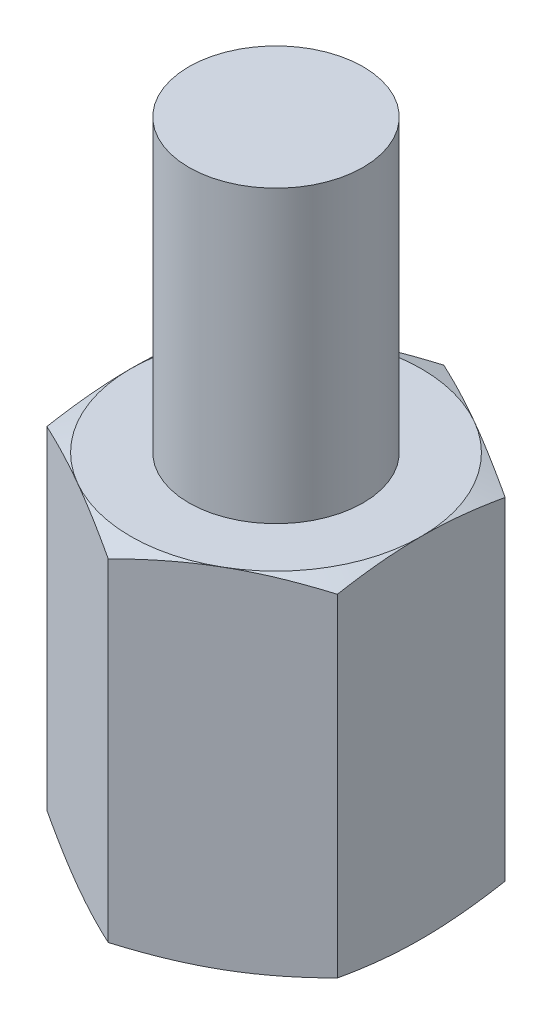
ISO-10303-21;
HEADER;
FILE_DESCRIPTION(('STEP AP214'),'2;1');
FILE_NAME('part.step','',(''),(''),'','','');
FILE_SCHEMA(('AUTOMOTIVE_DESIGN { 1 0 10303 214 1 1 1 1 }'));
ENDSEC;
DATA;
#1=APPLICATION_CONTEXT('core data for automotive mechanical design processes');
#2=APPLICATION_PROTOCOL_DEFINITION('international standard','automotive_design',2000,#1);
#3=PRODUCT_CONTEXT('',#1,'mechanical');
#4=PRODUCT('Part','Part','',(#3));
#5=PRODUCT_RELATED_PRODUCT_CATEGORY('part','',(#4));
#6=PRODUCT_DEFINITION_FORMATION('','',#4);
#7=PRODUCT_DEFINITION_CONTEXT('part definition',#1,'design');
#8=PRODUCT_DEFINITION('design','',#6,#7);
#9=PRODUCT_DEFINITION_SHAPE('','',#8);
#10=(LENGTH_UNIT() NAMED_UNIT(*) SI_UNIT(.MILLI.,.METRE.));
#11=(NAMED_UNIT(*) PLANE_ANGLE_UNIT() SI_UNIT($,.RADIAN.));
#12=(NAMED_UNIT(*) SI_UNIT($,.STERADIAN.) SOLID_ANGLE_UNIT());
#13=UNCERTAINTY_MEASURE_WITH_UNIT(LENGTH_MEASURE(1.E-05),#10,'distance_accuracy_value','');
#14=(GEOMETRIC_REPRESENTATION_CONTEXT(3) GLOBAL_UNCERTAINTY_ASSIGNED_CONTEXT((#13)) GLOBAL_UNIT_ASSIGNED_CONTEXT((#10,
#11,#12)) REPRESENTATION_CONTEXT('',''));
#15=CARTESIAN_POINT('',(0.,0.,0.));
#16=DIRECTION('',(0.,0.,1.));
#17=DIRECTION('',(1.,0.,0.));
#18=AXIS2_PLACEMENT_3D('',#15,#16,#17);
#19=CARTESIAN_POINT('',(0.,6.,0.));
#20=DIRECTION('',(0.,-1.,0.));
#21=DIRECTION('',(0.,0.,-1.));
#22=AXIS2_PLACEMENT_3D('',#19,#20,#21);
#23=CYLINDRICAL_SURFACE('',#22,1.5);
#24=CARTESIAN_POINT('',(0.,0.,0.));
#25=DIRECTION('',(0.,1.,0.));
#26=DIRECTION('',(0.,0.,1.));
#27=AXIS2_PLACEMENT_3D('',#24,#25,#26);
#28=CIRCLE('',#27,1.5);
#29=CARTESIAN_POINT('',(0.,0.,1.5));
#30=VERTEX_POINT('',#29);
#31=EDGE_CURVE('E260',#30,#30,#28,.T.);
#32=ORIENTED_EDGE('',*,*,#31,.F.);
#33=EDGE_LOOP('',(#32));
#34=FACE_BOUND('',#33,.T.);
#35=CARTESIAN_POINT('',(0.,4.5,0.));
#36=DIRECTION('',(0.,1.,0.));
#37=DIRECTION('',(0.,0.,1.));
#38=AXIS2_PLACEMENT_3D('',#35,#36,#37);
#39=CIRCLE('',#38,1.5);
#40=CARTESIAN_POINT('',(0.,4.5,1.5));
#41=VERTEX_POINT('',#40);
#42=EDGE_CURVE('E178',#41,#41,#39,.T.);
#43=ORIENTED_EDGE('',*,*,#42,.T.);
#44=EDGE_LOOP('',(#43));
#45=FACE_BOUND('',#44,.T.);
#46=ADVANCED_FACE('F43',(#34,#45),#23,.F.);
#47=CARTESIAN_POINT('',(0.,6.,0.));
#48=DIRECTION('',(0.,1.,0.));
#49=DIRECTION('',(0.,0.,1.));
#50=AXIS2_PLACEMENT_3D('',#47,#48,#49);
#51=PLANE('',#50);
#52=CARTESIAN_POINT('',(0.,6.,0.));
#53=DIRECTION('',(0.,-1.,0.));
#54=DIRECTION('',(0.,0.,-1.));
#55=AXIS2_PLACEMENT_3D('',#52,#53,#54);
#56=CIRCLE('',#55,2.5);
#57=CARTESIAN_POINT('',(-1.24999999999999,6.,2.1650635094611));
#58=VERTEX_POINT('',#57);
#59=CARTESIAN_POINT('',(-2.5,6.,0.));
#60=VERTEX_POINT('',#59);
#61=EDGE_CURVE('E394',#58,#60,#56,.T.);
#62=ORIENTED_EDGE('',*,*,#61,.F.);
#63=CARTESIAN_POINT('',(1.25000000000002,6.,2.16506350946109));
#64=VERTEX_POINT('',#63);
#65=EDGE_CURVE('E403',#64,#58,#56,.T.);
#66=ORIENTED_EDGE('',*,*,#65,.F.);
#67=CARTESIAN_POINT('',(2.5,6.,0.));
#68=VERTEX_POINT('',#67);
#69=EDGE_CURVE('E339',#68,#64,#56,.T.);
#70=ORIENTED_EDGE('',*,*,#69,.F.);
#71=CARTESIAN_POINT('',(1.24999999999999,6.,-2.16506350946111));
#72=VERTEX_POINT('',#71);
#73=EDGE_CURVE('E335',#72,#68,#56,.T.);
#74=ORIENTED_EDGE('',*,*,#73,.F.);
#75=CARTESIAN_POINT('',(-1.25,6.,-2.1650635094611));
#76=VERTEX_POINT('',#75);
#77=EDGE_CURVE('E340',#76,#72,#56,.T.);
#78=ORIENTED_EDGE('',*,*,#77,.F.);
#79=EDGE_CURVE('E387',#60,#76,#56,.T.);
#80=ORIENTED_EDGE('',*,*,#79,.F.);
#81=EDGE_LOOP('',(#62,#66,#70,#74,#78,#80));
#82=FACE_BOUND('',#81,.T.);
#83=CARTESIAN_POINT('',(0.,6.,0.));
#84=DIRECTION('',(0.,1.,0.));
#85=DIRECTION('',(0.,0.,1.));
#86=AXIS2_PLACEMENT_3D('',#83,#84,#85);
#87=CIRCLE('',#86,1.5);
#88=CARTESIAN_POINT('',(0.,6.,1.5));
#89=VERTEX_POINT('',#88);
#90=EDGE_CURVE('E259',#89,#89,#87,.T.);
#91=ORIENTED_EDGE('',*,*,#90,.F.);
#92=EDGE_LOOP('',(#91));
#93=FACE_BOUND('',#92,.T.);
#94=ADVANCED_FACE('F208',(#82,#93),#51,.T.);
#95=CARTESIAN_POINT('',(0.,0.,0.));
#96=DIRECTION('',(0.,1.,0.));
#97=DIRECTION('',(0.,0.,1.));
#98=AXIS2_PLACEMENT_3D('',#95,#96,#97);
#99=PLANE('',#98);
#100=CARTESIAN_POINT('',(0.,0.,0.));
#101=DIRECTION('',(0.,-1.,0.));
#102=DIRECTION('',(0.,0.,-1.));
#103=AXIS2_PLACEMENT_3D('',#100,#101,#102);
#104=CIRCLE('',#103,2.5);
#105=CARTESIAN_POINT('',(1.25000000000002,0.,2.16506350946109));
#106=VERTEX_POINT('',#105);
#107=CARTESIAN_POINT('',(-1.24999999999999,0.,2.1650635094611));
#108=VERTEX_POINT('',#107);
#109=EDGE_CURVE('E150',#106,#108,#104,.T.);
#110=ORIENTED_EDGE('',*,*,#109,.T.);
#111=CARTESIAN_POINT('',(-2.5,0.,0.));
#112=VERTEX_POINT('',#111);
#113=EDGE_CURVE('E181',#108,#112,#104,.T.);
#114=ORIENTED_EDGE('',*,*,#113,.T.);
#115=CARTESIAN_POINT('',(-1.25,0.,-2.1650635094611));
#116=VERTEX_POINT('',#115);
#117=EDGE_CURVE('E177',#112,#116,#104,.T.);
#118=ORIENTED_EDGE('',*,*,#117,.T.);
#119=CARTESIAN_POINT('',(1.24999999999999,0.,-2.16506350946111));
#120=VERTEX_POINT('',#119);
#121=EDGE_CURVE('E170',#116,#120,#104,.T.);
#122=ORIENTED_EDGE('',*,*,#121,.T.);
#123=CARTESIAN_POINT('',(2.5,0.,0.));
#124=VERTEX_POINT('',#123);
#125=EDGE_CURVE('E66',#120,#124,#104,.T.);
#126=ORIENTED_EDGE('',*,*,#125,.T.);
#127=EDGE_CURVE('E142',#124,#106,#104,.T.);
#128=ORIENTED_EDGE('',*,*,#127,.T.);
#129=EDGE_LOOP('',(#110,#114,#118,#122,#126,#128));
#130=FACE_BOUND('',#129,.T.);
#131=ORIENTED_EDGE('',*,*,#31,.T.);
#132=EDGE_LOOP('',(#131));
#133=FACE_BOUND('',#132,.T.);
#134=ADVANCED_FACE('F167',(#130,#133),#99,.F.);
#135=CARTESIAN_POINT('',(2.49999999999998,6.,-1.44337567297409));
#136=DIRECTION('',(-0.499999999999995,0.,0.866025403784441));
#137=DIRECTION('',(0.866025403784442,0.,0.499999999999995));
#138=AXIS2_PLACEMENT_3D('',#135,#136,#137);
#139=PLANE('',#138);
#140=DIRECTION('',(0.,-1.,0.));
#141=VECTOR('',#140,1.);
#142=CARTESIAN_POINT('',(2.49999999999998,6.,-1.44337567297409));
#143=LINE('',#142,#141);
#144=CARTESIAN_POINT('',(2.49999999999999,5.85923402201249,-1.44337567297409));
#145=VERTEX_POINT('',#144);
#146=CARTESIAN_POINT('',(2.49999999999998,0.140765977987506,-1.44337567297409));
#147=VERTEX_POINT('',#146);
#148=EDGE_CURVE('E256',#145,#147,#143,.T.);
#149=ORIENTED_EDGE('',*,*,#148,.T.);
#150=CARTESIAN_POINT('',(2.50019999999998,0.140808008171611,-1.44326020292026));
#151=CARTESIAN_POINT('',(2.39665305132346,0.119039069131315,-1.50304306161241));
#152=CARTESIAN_POINT('',(2.29276461388714,0.0992363286997188,-1.56302307893196));
#153=CARTESIAN_POINT('',(2.08431213823203,0.0643963200817523,-1.68337317186468));
#154=CARTESIAN_POINT('',(1.97974763612162,0.0493627822141135,-1.7437435153058));
#155=CARTESIAN_POINT('',(1.77110364851345,0.025046411161083,-1.86420417771618));
#156=CARTESIAN_POINT('',(1.6670289296066,0.0157105319226291,-1.92429174469288));
#157=CARTESIAN_POINT('',(1.45863606978594,0.00318847973073293,-2.04460741840753));
#158=CARTESIAN_POINT('',(1.35431803489297,0.,-2.10483546393432));
#159=CARTESIAN_POINT('',(1.14568196510702,0.,-2.2252915549879));
#160=CARTESIAN_POINT('',(1.04136393021405,0.00318847973073272,-2.28551960051469));
#161=CARTESIAN_POINT('',(0.832971070393385,0.015710531922629,-2.40583527422935));
#162=CARTESIAN_POINT('',(0.728896351486536,0.025046411161083,-2.46592284120605));
#163=CARTESIAN_POINT('',(0.520252363878367,0.0493627822141135,-2.58638350361642));
#164=CARTESIAN_POINT('',(0.415687861767961,0.0643963200817522,-2.64675384705754));
#165=CARTESIAN_POINT('',(0.207235386112848,0.0992363286997185,-2.76710393999026));
#166=CARTESIAN_POINT('',(0.103346948676527,0.119039069131315,-2.82708395730981));
#167=CARTESIAN_POINT('',(-0.0001999999999993,0.140808008171611,-2.88686681600197));
#168=B_SPLINE_CURVE_WITH_KNOTS('',3,(#150,#151,#152,#153,#154,#155,#156,#157,#158,#159,#160,
#161,#162,#163,#164,#165,#166,#167),.UNSPECIFIED.,.F.,.F.,(4,2,2,2,2,2,2,2,4),(0.,
0.364631406980055,0.729547317866326,1.09101180768958,1.45234063356534,1.8136694594411,
2.17513394926436,2.54004986015063,2.90468126713068),.UNSPECIFIED.);
#169=EDGE_CURVE('E155',#147,#120,#168,.T.);
#170=ORIENTED_EDGE('',*,*,#169,.T.);
#171=CARTESIAN_POINT('',(0.,0.140765977987506,-2.88675134594813));
#172=VERTEX_POINT('',#171);
#173=EDGE_CURVE('E326',#120,#172,#168,.T.);
#174=ORIENTED_EDGE('',*,*,#173,.T.);
#175=DIRECTION('',(0.,-1.,0.));
#176=VECTOR('',#175,1.);
#177=CARTESIAN_POINT('',(0.,6.,-2.88675134594813));
#178=LINE('',#177,#176);
#179=CARTESIAN_POINT('',(0.,5.85923402201249,-2.88675134594813));
#180=VERTEX_POINT('',#179);
#181=EDGE_CURVE('E239',#180,#172,#178,.T.);
#182=ORIENTED_EDGE('',*,*,#181,.F.);
#183=CARTESIAN_POINT('',(-0.000199999999999947,5.85919199182839,-2.88686681600197));
#184=CARTESIAN_POINT('',(0.103346948676526,5.88096093086869,-2.82708395730981));
#185=CARTESIAN_POINT('',(0.207235386112847,5.90076367130028,-2.76710393999026));
#186=CARTESIAN_POINT('',(0.41568786176796,5.93560367991825,-2.64675384705754));
#187=CARTESIAN_POINT('',(0.520252363878367,5.95063721778589,-2.58638350361642));
#188=CARTESIAN_POINT('',(0.728896351486535,5.97495358883892,-2.46592284120605));
#189=CARTESIAN_POINT('',(0.832971070393384,5.98428946807737,-2.40583527422935));
#190=CARTESIAN_POINT('',(1.04136393021405,5.99681152026927,-2.28551960051469));
#191=CARTESIAN_POINT('',(1.14568196510702,6.,-2.2252915549879));
#192=CARTESIAN_POINT('',(1.35431803489297,6.,-2.10483546393432));
#193=CARTESIAN_POINT('',(1.45863606978594,5.99681152026927,-2.04460741840753));
#194=CARTESIAN_POINT('',(1.6670289296066,5.98428946807737,-1.92429174469288));
#195=CARTESIAN_POINT('',(1.77110364851345,5.97495358883892,-1.86420417771618));
#196=CARTESIAN_POINT('',(1.97974763612162,5.95063721778589,-1.7437435153058));
#197=CARTESIAN_POINT('',(2.08431213823203,5.93560367991825,-1.68337317186468));
#198=CARTESIAN_POINT('',(2.29276461388714,5.90076367130028,-1.56302307893196));
#199=CARTESIAN_POINT('',(2.39665305132346,5.88096093086869,-1.50304306161241));
#200=CARTESIAN_POINT('',(2.50019999999998,5.85919199182839,-1.44326020292026));
#201=B_SPLINE_CURVE_WITH_KNOTS('',3,(#183,#184,#185,#186,#187,#188,#189,#190,#191,#192,#193,
#194,#195,#196,#197,#198,#199,#200),.UNSPECIFIED.,.F.,.F.,(4,2,2,2,2,2,2,2,4),(0.,
0.364631406980055,0.729547317866326,1.09101180768958,1.45234063356534,1.8136694594411,
2.17513394926436,2.54004986015063,2.90468126713068),.UNSPECIFIED.);
#202=EDGE_CURVE('E355',#180,#72,#201,.T.);
#203=ORIENTED_EDGE('',*,*,#202,.T.);
#204=EDGE_CURVE('E347',#72,#145,#201,.T.);
#205=ORIENTED_EDGE('',*,*,#204,.T.);
#206=EDGE_LOOP('',(#149,#170,#174,#182,#203,#205));
#207=FACE_BOUND('',#206,.T.);
#208=ADVANCED_FACE('F45',(#207),#139,.F.);
#209=CARTESIAN_POINT('',(0.,6.,-2.88675134594813));
#210=DIRECTION('',(0.500000000000001,0.,0.866025403784438));
#211=DIRECTION('',(0.866025403784438,0.,-0.500000000000001));
#212=AXIS2_PLACEMENT_3D('',#209,#210,#211);
#213=PLANE('',#212);
#214=ORIENTED_EDGE('',*,*,#181,.T.);
#215=CARTESIAN_POINT('',(0.000200000000000051,0.140808008171612,-2.88686681600197));
#216=CARTESIAN_POINT('',(-0.103346948676527,0.119039069131315,-2.82708395730981));
#217=CARTESIAN_POINT('',(-0.207235386112849,0.0992363286997179,-2.76710393999026));
#218=CARTESIAN_POINT('',(-0.415687861767963,0.0643963200817505,-2.64675384705754));
#219=CARTESIAN_POINT('',(-0.520252363878371,0.0493627822141112,-2.58638350361641));
#220=CARTESIAN_POINT('',(-0.728896351486541,0.02504641116108,-2.46592284120604));
#221=CARTESIAN_POINT('',(-0.832971070393391,0.0157105319226258,-2.40583527422933));
#222=CARTESIAN_POINT('',(-1.04136393021405,0.00318847973072924,-2.28551960051468));
#223=CARTESIAN_POINT('',(-1.14568196510703,0.,-2.22529155498789));
#224=CARTESIAN_POINT('',(-1.35431803489298,0.,-2.1048354639343));
#225=CARTESIAN_POINT('',(-1.45863606978595,0.00318847973072923,-2.04460741840751));
#226=CARTESIAN_POINT('',(-1.66702892960661,0.0157105319226257,-1.92429174469286));
#227=CARTESIAN_POINT('',(-1.77110364851346,0.0250464111610799,-1.86420417771615));
#228=CARTESIAN_POINT('',(-1.97974763612163,0.049362782214111,-1.74374351530578));
#229=CARTESIAN_POINT('',(-2.08431213823204,0.0643963200817502,-1.68337317186465));
#230=CARTESIAN_POINT('',(-2.29276461388716,0.0992363286997176,-1.56302307893193));
#231=CARTESIAN_POINT('',(-2.39665305132348,0.119039069131314,-1.50304306161238));
#232=CARTESIAN_POINT('',(-2.5002,0.140808008171611,-1.44326020292022));
#233=B_SPLINE_CURVE_WITH_KNOTS('',3,(#215,#216,#217,#218,#219,#220,#221,#222,#223,#224,#225,
#226,#227,#228,#229,#230,#231,#232),.UNSPECIFIED.,.F.,.F.,(4,2,2,2,2,2,2,2,4),(0.,
0.364631406980059,0.729547317866335,1.0910118076896,1.45234063356536,1.81366945944112,
2.17513394926438,2.54004986015066,2.90468126713072),.UNSPECIFIED.);
#234=EDGE_CURVE('E334',#172,#116,#233,.T.);
#235=ORIENTED_EDGE('',*,*,#234,.T.);
#236=CARTESIAN_POINT('',(-2.5,0.140765977987506,-1.44337567297406));
#237=VERTEX_POINT('',#236);
#238=EDGE_CURVE('E308',#116,#237,#233,.T.);
#239=ORIENTED_EDGE('',*,*,#238,.T.);
#240=DIRECTION('',(0.,-1.,0.));
#241=VECTOR('',#240,1.);
#242=CARTESIAN_POINT('',(-2.5,6.,-1.44337567297406));
#243=LINE('',#242,#241);
#244=CARTESIAN_POINT('',(-2.5,5.85923402201249,-1.44337567297406));
#245=VERTEX_POINT('',#244);
#246=EDGE_CURVE('E243',#245,#237,#243,.T.);
#247=ORIENTED_EDGE('',*,*,#246,.F.);
#248=CARTESIAN_POINT('',(-2.5002,5.85919199182839,-1.44326020292022));
#249=CARTESIAN_POINT('',(-2.39665305132348,5.88096093086869,-1.50304306161238));
#250=CARTESIAN_POINT('',(-2.29276461388716,5.90076367130028,-1.56302307893193));
#251=CARTESIAN_POINT('',(-2.08431213823204,5.93560367991825,-1.68337317186465));
#252=CARTESIAN_POINT('',(-1.97974763612163,5.95063721778589,-1.74374351530578));
#253=CARTESIAN_POINT('',(-1.77110364851346,5.97495358883892,-1.86420417771615));
#254=CARTESIAN_POINT('',(-1.66702892960661,5.98428946807737,-1.92429174469286));
#255=CARTESIAN_POINT('',(-1.45863606978595,5.99681152026927,-2.04460741840751));
#256=CARTESIAN_POINT('',(-1.35431803489298,6.,-2.1048354639343));
#257=CARTESIAN_POINT('',(-1.14568196510703,6.,-2.22529155498789));
#258=CARTESIAN_POINT('',(-1.04136393021405,5.99681152026927,-2.28551960051468));
#259=CARTESIAN_POINT('',(-0.832971070393391,5.98428946807737,-2.40583527422933));
#260=CARTESIAN_POINT('',(-0.728896351486541,5.97495358883892,-2.46592284120604));
#261=CARTESIAN_POINT('',(-0.520252363878371,5.95063721778589,-2.58638350361641));
#262=CARTESIAN_POINT('',(-0.415687861767963,5.93560367991825,-2.64675384705754));
#263=CARTESIAN_POINT('',(-0.207235386112849,5.90076367130028,-2.76710393999026));
#264=CARTESIAN_POINT('',(-0.103346948676527,5.88096093086869,-2.82708395730981));
#265=CARTESIAN_POINT('',(0.000199999999999951,5.85919199182839,-2.88686681600197));
#266=B_SPLINE_CURVE_WITH_KNOTS('',3,(#248,#249,#250,#251,#252,#253,#254,#255,#256,#257,#258,
#259,#260,#261,#262,#263,#264,#265),.UNSPECIFIED.,.F.,.F.,(4,2,2,2,2,2,2,2,4),(0.,
0.364631406980059,0.729547317866335,1.0910118076896,1.45234063356536,1.81366945944112,
2.17513394926439,2.54004986015066,2.90468126713072),.UNSPECIFIED.);
#267=EDGE_CURVE('E369',#245,#76,#266,.T.);
#268=ORIENTED_EDGE('',*,*,#267,.T.);
#269=EDGE_CURVE('E277',#76,#180,#266,.T.);
#270=ORIENTED_EDGE('',*,*,#269,.T.);
#271=EDGE_LOOP('',(#214,#235,#239,#247,#268,#270));
#272=FACE_BOUND('',#271,.T.);
#273=ADVANCED_FACE('F287',(#272),#213,.F.);
#274=CARTESIAN_POINT('',(-2.5,6.,-1.44337567297406));
#275=DIRECTION('',(1.,0.,0.));
#276=DIRECTION('',(0.,0.,-1.));
#277=AXIS2_PLACEMENT_3D('',#274,#275,#276);
#278=PLANE('',#277);
#279=ORIENTED_EDGE('',*,*,#246,.T.);
#280=CARTESIAN_POINT('',(-2.50000000000001,0.911069918498288,-4.33375705030873));
#281=CARTESIAN_POINT('',(-2.50000000000001,0.857151962741812,-4.1626121487893));
#282=CARTESIAN_POINT('',(-2.50000000000001,0.803889247670842,-3.99125292656233));
#283=CARTESIAN_POINT('',(-2.50000000000001,0.699303356408631,-3.6479012296047));
#284=CARTESIAN_POINT('',(-2.50000000000001,0.647980635713844,-3.47590861643411));
#285=CARTESIAN_POINT('',(-2.50000000000001,0.547192255797197,-3.12862476065281));
#286=CARTESIAN_POINT('',(-2.50000000000001,0.497765115102514,-2.95332226186823));
#287=CARTESIAN_POINT('',(-2.50000000000001,0.402640277745618,-2.60170577064684));
#288=CARTESIAN_POINT('',(-2.50000000000001,0.356942439150244,-2.42539181697851));
#289=CARTESIAN_POINT('',(-2.50000000000001,0.272638394402238,-2.079015966178));
#290=CARTESIAN_POINT('',(-2.50000000000001,0.23381285721517,-1.90900813322596));
#291=CARTESIAN_POINT('',(-2.50000000000001,0.162867038370284,-1.56755699875981));
#292=CARTESIAN_POINT('',(-2.5,0.130747206656142,-1.39611360172359));
#293=CARTESIAN_POINT('',(-2.5,0.0758518227791671,-1.05306244520634));
#294=CARTESIAN_POINT('',(-2.5,0.0530056159219204,-0.881466309778314));
#295=CARTESIAN_POINT('',(-2.5,0.0188225697475267,-0.537127667934878));
#296=CARTESIAN_POINT('',(-2.5,0.00748169084072173,-0.364385585324893));
#297=CARTESIAN_POINT('',(-2.5,4.41044611643525E-05,-0.097393884714278));
#298=CARTESIAN_POINT('',(-2.5,-0.000644888189889834,-0.00325681931257186));
#299=CARTESIAN_POINT('',(-2.5,0.00184631107398365,0.184970103743175));
#300=CARTESIAN_POINT('',(-2.5,0.00502655264592363,0.279059960775849));
#301=CARTESIAN_POINT('',(-2.5,0.0151239518844881,0.467060430735583));
#302=CARTESIAN_POINT('',(-2.5,0.0220420903773777,0.560970990121263));
#303=CARTESIAN_POINT('',(-2.5,0.0393313521905035,0.748477331015612));
#304=CARTESIAN_POINT('',(-2.5,0.0497028075871423,0.842073081377101));
#305=CARTESIAN_POINT('',(-2.5,0.0856400575240508,1.12380926395695));
#306=CARTESIAN_POINT('',(-2.5,0.115934676805286,1.31134961033419));
#307=CARTESIAN_POINT('',(-2.49999999999999,0.185757521056653,1.68464568549849));
#308=CARTESIAN_POINT('',(-2.49999999999999,0.225286525445448,1.87040126226529));
#309=CARTESIAN_POINT('',(-2.49999999999999,0.312868160934003,2.2492938430945));
#310=CARTESIAN_POINT('',(-2.49999999999999,0.361239314019709,2.44235614952978));
#311=CARTESIAN_POINT('',(-2.49999999999999,0.462845732200084,2.82717406569172));
#312=CARTESIAN_POINT('',(-2.49999999999999,0.516080908992447,3.01892969907207));
#313=CARTESIAN_POINT('',(-2.49999999999999,0.625017863722866,3.39827826743581));
#314=CARTESIAN_POINT('',(-2.49999999999999,0.680663797121242,3.58588734311866));
#315=CARTESIAN_POINT('',(-2.49999999999999,0.765880720880502,3.86673968266629));
#316=CARTESIAN_POINT('',(-2.49999999999999,0.794573796432836,3.96025127643636));
#317=CARTESIAN_POINT('',(-2.49999999999999,0.852463883475552,4.14711653548762));
#318=CARTESIAN_POINT('',(-2.49999999999999,0.881660885655843,4.24047020365159));
#319=CARTESIAN_POINT('',(-2.49999999999999,0.911069918498289,4.33375705030875));
#320=B_SPLINE_CURVE_WITH_KNOTS('',3,(#280,#281,#282,#283,#284,#285,#286,#287,#288,#289,#290,
#291,#292,#293,#294,#295,#296,#297,#298,#299,#300,#301,#302,#303,#304,#305,#306,#307,#308,#309,
#310,#311,#312,#313,#314,#315,#316,#317,#318,#319),.UNSPECIFIED.,.F.,.F.,(4,2,2,2,2,2,2,2,2,2,2,
2,2,2,2,2,2,2,2,4),(0.,0.538321778022808,1.0767691747435,1.6231524355488,2.16951489189722,
2.69257527905729,3.21567075158284,3.73470243407139,4.25355181828763,4.53589900114565,
4.81824980763166,5.10067473913603,5.38312683691474,5.95267633652756,6.52227392575275,
7.11926798158167,7.71625120163244,8.3032921668782,8.59673518713048,8.89017279178626),.UNSPECIFIED.);
#321=EDGE_CURVE('E302',#237,#112,#320,.T.);
#322=ORIENTED_EDGE('',*,*,#321,.T.);
#323=CARTESIAN_POINT('',(-2.49999999999999,0.140765977987506,1.44337567297408));
#324=VERTEX_POINT('',#323);
#325=EDGE_CURVE('E293',#112,#324,#320,.T.);
#326=ORIENTED_EDGE('',*,*,#325,.T.);
#327=DIRECTION('',(0.,-1.,0.));
#328=VECTOR('',#327,1.);
#329=CARTESIAN_POINT('',(-2.5,6.,1.44337567297408));
#330=LINE('',#329,#328);
#331=CARTESIAN_POINT('',(-2.49999999999999,5.85923402201249,1.44337567297408));
#332=VERTEX_POINT('',#331);
#333=EDGE_CURVE('E247',#332,#324,#330,.T.);
#334=ORIENTED_EDGE('',*,*,#333,.F.);
#335=CARTESIAN_POINT('',(-2.49999999999999,5.08893008150171,4.33375705030875));
#336=CARTESIAN_POINT('',(-2.49999999999999,5.14284803725819,4.16261214878932));
#337=CARTESIAN_POINT('',(-2.49999999999999,5.19611075232916,3.99125292656235));
#338=CARTESIAN_POINT('',(-2.49999999999999,5.30069664359137,3.64790122960472));
#339=CARTESIAN_POINT('',(-2.49999999999999,5.35201936428616,3.47590861643412));
#340=CARTESIAN_POINT('',(-2.49999999999999,5.4528077442028,3.12862476065282));
#341=CARTESIAN_POINT('',(-2.49999999999999,5.50223488489749,2.95332226186824));
#342=CARTESIAN_POINT('',(-2.49999999999999,5.59735972225438,2.60170577064686));
#343=CARTESIAN_POINT('',(-2.49999999999999,5.64305756084976,2.42539181697853));
#344=CARTESIAN_POINT('',(-2.49999999999999,5.72736160559776,2.07901596617802));
#345=CARTESIAN_POINT('',(-2.49999999999999,5.76618714278483,1.90900813322597));
#346=CARTESIAN_POINT('',(-2.49999999999999,5.83713296162972,1.56755699875983));
#347=CARTESIAN_POINT('',(-2.5,5.86925279334386,1.39611360172361));
#348=CARTESIAN_POINT('',(-2.5,5.92414817722083,1.05306244520636));
#349=CARTESIAN_POINT('',(-2.5,5.94699438407808,0.88146630977833));
#350=CARTESIAN_POINT('',(-2.5,5.98117743025247,0.537127667934894));
#351=CARTESIAN_POINT('',(-2.5,5.99251830915928,0.364385585324909));
#352=CARTESIAN_POINT('',(-2.5,5.99995589553884,0.0973938847142936));
#353=CARTESIAN_POINT('',(-2.5,6.00064488818989,0.00325681931258734));
#354=CARTESIAN_POINT('',(-2.5,5.99815368892602,-0.18497010374316));
#355=CARTESIAN_POINT('',(-2.5,5.99497344735408,-0.279059960775834));
#356=CARTESIAN_POINT('',(-2.5,5.98487604811551,-0.467060430735568));
#357=CARTESIAN_POINT('',(-2.5,5.97795790962262,-0.560970990121248));
#358=CARTESIAN_POINT('',(-2.5,5.9606686478095,-0.748477331015597));
#359=CARTESIAN_POINT('',(-2.5,5.95029719241286,-0.842073081377085));
#360=CARTESIAN_POINT('',(-2.5,5.91435994247595,-1.12380926395693));
#361=CARTESIAN_POINT('',(-2.5,5.88406532319471,-1.31134961033417));
#362=CARTESIAN_POINT('',(-2.50000000000001,5.81424247894335,-1.68464568549847));
#363=CARTESIAN_POINT('',(-2.50000000000001,5.77471347455455,-1.87040126226527));
#364=CARTESIAN_POINT('',(-2.50000000000001,5.687131839066,-2.24929384309449));
#365=CARTESIAN_POINT('',(-2.50000000000001,5.63876068598029,-2.44235614952976));
#366=CARTESIAN_POINT('',(-2.50000000000001,5.53715426779992,-2.8271740656917));
#367=CARTESIAN_POINT('',(-2.50000000000001,5.48391909100755,-3.01892969907205));
#368=CARTESIAN_POINT('',(-2.50000000000001,5.37498213627713,-3.39827826743579));
#369=CARTESIAN_POINT('',(-2.50000000000001,5.31933620287876,-3.58588734311864));
#370=CARTESIAN_POINT('',(-2.50000000000001,5.2341192791195,-3.86673968266627));
#371=CARTESIAN_POINT('',(-2.50000000000001,5.20542620356716,-3.96025127643634));
#372=CARTESIAN_POINT('',(-2.50000000000001,5.14753611652445,-4.14711653548761));
#373=CARTESIAN_POINT('',(-2.50000000000001,5.11833911434416,-4.24047020365157));
#374=CARTESIAN_POINT('',(-2.50000000000001,5.08893008150171,-4.33375705030873));
#375=B_SPLINE_CURVE_WITH_KNOTS('',3,(#335,#336,#337,#338,#339,#340,#341,#342,#343,#344,#345,
#346,#347,#348,#349,#350,#351,#352,#353,#354,#355,#356,#357,#358,#359,#360,#361,#362,#363,#364,
#365,#366,#367,#368,#369,#370,#371,#372,#373,#374),.UNSPECIFIED.,.F.,.F.,(4,2,2,2,2,2,2,2,2,2,2,
2,2,2,2,2,2,2,2,4),(0.,0.538321778022808,1.07676917474351,1.6231524355488,2.16951489189722,
2.69257527905729,3.21567075158284,3.73470243407139,4.25355181828763,4.53589900114565,
4.81824980763166,5.10067473913603,5.38312683691474,5.95267633652756,6.52227392575275,
7.11926798158167,7.71625120163244,8.3032921668782,8.59673518713048,8.89017279178626),.UNSPECIFIED.);
#376=EDGE_CURVE('E264',#332,#60,#375,.T.);
#377=ORIENTED_EDGE('',*,*,#376,.T.);
#378=EDGE_CURVE('E267',#60,#245,#375,.T.);
#379=ORIENTED_EDGE('',*,*,#378,.T.);
#380=EDGE_LOOP('',(#279,#322,#326,#334,#377,#379));
#381=FACE_BOUND('',#380,.T.);
#382=ADVANCED_FACE('F283',(#381),#278,.F.);
#383=CARTESIAN_POINT('',(-2.5,6.,1.44337567297408));
#384=DIRECTION('',(0.499999999999995,0.,-0.866025403784442));
#385=DIRECTION('',(-0.866025403784442,0.,-0.499999999999995));
#386=AXIS2_PLACEMENT_3D('',#383,#384,#385);
#387=PLANE('',#386);
#388=ORIENTED_EDGE('',*,*,#333,.T.);
#389=CARTESIAN_POINT('',(-2.5002,0.140808008171612,1.44326020292024));
#390=CARTESIAN_POINT('',(-2.39665305132347,0.119039069131314,1.5030430616124));
#391=CARTESIAN_POINT('',(-2.29276461388715,0.0992363286997177,1.56302307893195));
#392=CARTESIAN_POINT('',(-2.08431213823203,0.0643963200817504,1.68337317186467));
#393=CARTESIAN_POINT('',(-1.97974763612162,0.0493627822141112,1.74374351530579));
#394=CARTESIAN_POINT('',(-1.77110364851345,0.02504641116108,1.86420417771616));
#395=CARTESIAN_POINT('',(-1.6670289296066,0.0157105319226258,1.92429174469287));
#396=CARTESIAN_POINT('',(-1.45863606978594,0.00318847973072916,2.04460741840752));
#397=CARTESIAN_POINT('',(-1.35431803489296,0.,2.10483546393431));
#398=CARTESIAN_POINT('',(-1.14568196510701,0.,2.22529155498789));
#399=CARTESIAN_POINT('',(-1.04136393021404,0.00318847973072908,2.28551960051469));
#400=CARTESIAN_POINT('',(-0.832971070393375,0.0157105319226256,2.40583527422934));
#401=CARTESIAN_POINT('',(-0.728896351486524,0.0250464111610798,2.46592284120604));
#402=CARTESIAN_POINT('',(-0.520252363878353,0.049362782214111,2.58638350361642));
#403=CARTESIAN_POINT('',(-0.415687861767945,0.0643963200817502,2.64675384705754));
#404=CARTESIAN_POINT('',(-0.20723538611283,0.0992363286997175,2.76710393999026));
#405=CARTESIAN_POINT('',(-0.103346948676508,0.119039069131314,2.82708395730981));
#406=CARTESIAN_POINT('',(0.000200000000019801,0.140808008171611,2.88686681600197));
#407=B_SPLINE_CURVE_WITH_KNOTS('',3,(#389,#390,#391,#392,#393,#394,#395,#396,#397,#398,#399,
#400,#401,#402,#403,#404,#405,#406),.UNSPECIFIED.,.F.,.F.,(4,2,2,2,2,2,2,2,4),(0.,
0.36463140698006,0.729547317866335,1.0910118076896,1.45234063356536,1.81366945944112,
2.17513394926439,2.54004986015066,2.90468126713072),.UNSPECIFIED.);
#408=EDGE_CURVE('E74',#324,#108,#407,.T.);
#409=ORIENTED_EDGE('',*,*,#408,.T.);
#410=CARTESIAN_POINT('',(0.,0.140765977987506,2.88675134594813));
#411=VERTEX_POINT('',#410);
#412=EDGE_CURVE('E303',#108,#411,#407,.T.);
#413=ORIENTED_EDGE('',*,*,#412,.T.);
#414=DIRECTION('',(0.,-1.,0.));
#415=VECTOR('',#414,1.);
#416=CARTESIAN_POINT('',(0.,6.,2.88675134594813));
#417=LINE('',#416,#415);
#418=CARTESIAN_POINT('',(0.,5.85923402201249,2.88675134594813));
#419=VERTEX_POINT('',#418);
#420=EDGE_CURVE('E250',#419,#411,#417,.T.);
#421=ORIENTED_EDGE('',*,*,#420,.F.);
#422=CARTESIAN_POINT('',(0.000200000000020158,5.85919199182839,2.88686681600197));
#423=CARTESIAN_POINT('',(-0.103346948676508,5.88096093086869,2.82708395730981));
#424=CARTESIAN_POINT('',(-0.20723538611283,5.90076367130028,2.76710393999026));
#425=CARTESIAN_POINT('',(-0.415687861767945,5.93560367991825,2.64675384705754));
#426=CARTESIAN_POINT('',(-0.520252363878353,5.95063721778589,2.58638350361642));
#427=CARTESIAN_POINT('',(-0.728896351486524,5.97495358883892,2.46592284120604));
#428=CARTESIAN_POINT('',(-0.832971070393375,5.98428946807737,2.40583527422934));
#429=CARTESIAN_POINT('',(-1.04136393021404,5.99681152026927,2.28551960051469));
#430=CARTESIAN_POINT('',(-1.14568196510701,6.,2.22529155498789));
#431=CARTESIAN_POINT('',(-1.35431803489296,6.,2.10483546393431));
#432=CARTESIAN_POINT('',(-1.45863606978594,5.99681152026927,2.04460741840752));
#433=CARTESIAN_POINT('',(-1.6670289296066,5.98428946807737,1.92429174469287));
#434=CARTESIAN_POINT('',(-1.77110364851345,5.97495358883892,1.86420417771616));
#435=CARTESIAN_POINT('',(-1.97974763612162,5.95063721778589,1.74374351530579));
#436=CARTESIAN_POINT('',(-2.08431213823203,5.93560367991825,1.68337317186467));
#437=CARTESIAN_POINT('',(-2.29276461388715,5.90076367130028,1.56302307893195));
#438=CARTESIAN_POINT('',(-2.39665305132347,5.88096093086869,1.5030430616124));
#439=CARTESIAN_POINT('',(-2.5002,5.85919199182839,1.44326020292024));
#440=B_SPLINE_CURVE_WITH_KNOTS('',3,(#422,#423,#424,#425,#426,#427,#428,#429,#430,#431,#432,
#433,#434,#435,#436,#437,#438,#439),.UNSPECIFIED.,.F.,.F.,(4,2,2,2,2,2,2,2,4),(0.,
0.36463140698006,0.729547317866335,1.0910118076896,1.45234063356536,1.81366945944112,
2.17513394926439,2.54004986015066,2.90468126713072),.UNSPECIFIED.);
#441=EDGE_CURVE('E356',#419,#58,#440,.T.);
#442=ORIENTED_EDGE('',*,*,#441,.T.);
#443=EDGE_CURVE('E276',#58,#332,#440,.T.);
#444=ORIENTED_EDGE('',*,*,#443,.T.);
#445=EDGE_LOOP('',(#388,#409,#413,#421,#442,#444));
#446=FACE_BOUND('',#445,.T.);
#447=ADVANCED_FACE('F286',(#446),#387,.F.);
#448=CARTESIAN_POINT('',(0.,6.,2.88675134594813));
#449=DIRECTION('',(-0.500000000000007,0.,-0.866025403784435));
#450=DIRECTION('',(-0.866025403784435,0.,0.500000000000007));
#451=AXIS2_PLACEMENT_3D('',#448,#449,#450);
#452=PLANE('',#451);
#453=ORIENTED_EDGE('',*,*,#420,.T.);
#454=CARTESIAN_POINT('',(-0.000199999999979897,0.140808008171611,2.88686681600197));
#455=CARTESIAN_POINT('',(0.103346948676547,0.119039069131314,2.82708395730981));
#456=CARTESIAN_POINT('',(0.207235386112869,0.0992363286997175,2.76710393999026));
#457=CARTESIAN_POINT('',(0.415687861767982,0.0643963200817502,2.64675384705753));
#458=CARTESIAN_POINT('',(0.520252363878389,0.049362782214111,2.58638350361641));
#459=CARTESIAN_POINT('',(0.728896351486559,0.0250464111610799,2.46592284120603));
#460=CARTESIAN_POINT('',(0.832971070393408,0.0157105319226257,2.40583527422933));
#461=CARTESIAN_POINT('',(1.04136393021407,0.00318847973072912,2.28551960051467));
#462=CARTESIAN_POINT('',(1.14568196510704,0.,2.22529155498788));
#463=CARTESIAN_POINT('',(1.35431803489299,0.,2.10483546393429));
#464=CARTESIAN_POINT('',(1.45863606978597,0.00318847973072921,2.0446074184075));
#465=CARTESIAN_POINT('',(1.66702892960663,0.0157105319226258,1.92429174469284));
#466=CARTESIAN_POINT('',(1.77110364851348,0.02504641116108,1.86420417771614));
#467=CARTESIAN_POINT('',(1.97974763612165,0.0493627822141112,1.74374351530576));
#468=CARTESIAN_POINT('',(2.08431213823205,0.0643963200817505,1.68337317186464));
#469=CARTESIAN_POINT('',(2.29276461388717,0.0992363286997179,1.56302307893191));
#470=CARTESIAN_POINT('',(2.39665305132349,0.119039069131315,1.50304306161236));
#471=CARTESIAN_POINT('',(2.50020000000002,0.140808008171612,1.4432602029202));
#472=B_SPLINE_CURVE_WITH_KNOTS('',3,(#454,#455,#456,#457,#458,#459,#460,#461,#462,#463,#464,
#465,#466,#467,#468,#469,#470,#471),.UNSPECIFIED.,.F.,.F.,(4,2,2,2,2,2,2,2,4),(0.,
0.36463140698006,0.729547317866335,1.0910118076896,1.45234063356536,1.81366945944112,
2.17513394926439,2.54004986015066,2.90468126713072),.UNSPECIFIED.);
#473=EDGE_CURVE('E173',#411,#106,#472,.T.);
#474=ORIENTED_EDGE('',*,*,#473,.T.);
#475=CARTESIAN_POINT('',(2.50000000000002,0.140765977987506,1.44337567297404));
#476=VERTEX_POINT('',#475);
#477=EDGE_CURVE('E145',#106,#476,#472,.T.);
#478=ORIENTED_EDGE('',*,*,#477,.T.);
#479=DIRECTION('',(0.,-1.,0.));
#480=VECTOR('',#479,1.);
#481=CARTESIAN_POINT('',(2.50000000000002,6.,1.44337567297404));
#482=LINE('',#481,#480);
#483=CARTESIAN_POINT('',(2.50000000000002,5.85923402201249,1.44337567297404));
#484=VERTEX_POINT('',#483);
#485=EDGE_CURVE('E165',#484,#476,#482,.T.);
#486=ORIENTED_EDGE('',*,*,#485,.F.);
#487=CARTESIAN_POINT('',(2.50020000000002,5.85919199182839,1.4432602029202));
#488=CARTESIAN_POINT('',(2.39665305132349,5.88096093086869,1.50304306161236));
#489=CARTESIAN_POINT('',(2.29276461388717,5.90076367130028,1.56302307893191));
#490=CARTESIAN_POINT('',(2.08431213823205,5.93560367991825,1.68337317186464));
#491=CARTESIAN_POINT('',(1.97974763612165,5.95063721778589,1.74374351530576));
#492=CARTESIAN_POINT('',(1.77110364851348,5.97495358883892,1.86420417771614));
#493=CARTESIAN_POINT('',(1.66702892960663,5.98428946807737,1.92429174469284));
#494=CARTESIAN_POINT('',(1.45863606978597,5.99681152026927,2.0446074184075));
#495=CARTESIAN_POINT('',(1.35431803489299,6.,2.10483546393429));
#496=CARTESIAN_POINT('',(1.14568196510704,6.,2.22529155498788));
#497=CARTESIAN_POINT('',(1.04136393021407,5.99681152026927,2.28551960051467));
#498=CARTESIAN_POINT('',(0.832971070393408,5.98428946807737,2.40583527422933));
#499=CARTESIAN_POINT('',(0.728896351486559,5.97495358883892,2.46592284120603));
#500=CARTESIAN_POINT('',(0.520252363878389,5.95063721778589,2.58638350361641));
#501=CARTESIAN_POINT('',(0.415687861767982,5.93560367991825,2.64675384705753));
#502=CARTESIAN_POINT('',(0.207235386112869,5.90076367130028,2.76710393999026));
#503=CARTESIAN_POINT('',(0.103346948676547,5.88096093086869,2.82708395730981));
#504=CARTESIAN_POINT('',(-0.000199999999979689,5.85919199182839,2.88686681600197));
#505=B_SPLINE_CURVE_WITH_KNOTS('',3,(#487,#488,#489,#490,#491,#492,#493,#494,#495,#496,#497,
#498,#499,#500,#501,#502,#503,#504),.UNSPECIFIED.,.F.,.F.,(4,2,2,2,2,2,2,2,4),(0.,
0.36463140698006,0.729547317866335,1.0910118076896,1.45234063356536,1.81366945944112,
2.17513394926439,2.54004986015066,2.90468126713072),.UNSPECIFIED.);
#506=EDGE_CURVE('E338',#484,#64,#505,.T.);
#507=ORIENTED_EDGE('',*,*,#506,.T.);
#508=EDGE_CURVE('E348',#64,#419,#505,.T.);
#509=ORIENTED_EDGE('',*,*,#508,.T.);
#510=EDGE_LOOP('',(#453,#474,#478,#486,#507,#509));
#511=FACE_BOUND('',#510,.T.);
#512=ADVANCED_FACE('F228',(#511),#452,.F.);
#513=CARTESIAN_POINT('',(2.50000000000002,6.,1.44337567297404));
#514=DIRECTION('',(-1.,0.,0.));
#515=DIRECTION('',(0.,0.,1.));
#516=AXIS2_PLACEMENT_3D('',#513,#514,#515);
#517=PLANE('',#516);
#518=ORIENTED_EDGE('',*,*,#485,.T.);
#519=CARTESIAN_POINT('',(2.50000000000005,0.911069918498289,4.33375705030872));
#520=CARTESIAN_POINT('',(2.50000000000004,0.857151962741812,4.16261214878928));
#521=CARTESIAN_POINT('',(2.50000000000004,0.803889247670842,3.99125292656231));
#522=CARTESIAN_POINT('',(2.50000000000004,0.699303356408631,3.64790122960468));
#523=CARTESIAN_POINT('',(2.50000000000004,0.647980635713845,3.47590861643409));
#524=CARTESIAN_POINT('',(2.50000000000003,0.547192255797197,3.12862476065279));
#525=CARTESIAN_POINT('',(2.50000000000003,0.497765115102514,2.95332226186821));
#526=CARTESIAN_POINT('',(2.50000000000003,0.402640277745618,2.60170577064683));
#527=CARTESIAN_POINT('',(2.50000000000003,0.356942439150244,2.4253918169785));
#528=CARTESIAN_POINT('',(2.50000000000002,0.272638394402238,2.07901596617798));
#529=CARTESIAN_POINT('',(2.50000000000002,0.23381285721517,1.90900813322594));
#530=CARTESIAN_POINT('',(2.50000000000002,0.162867038370284,1.5675569987598));
#531=CARTESIAN_POINT('',(2.50000000000001,0.130747206656142,1.39611360172357));
#532=CARTESIAN_POINT('',(2.50000000000001,0.0758518227791669,1.05306244520633));
#533=CARTESIAN_POINT('',(2.50000000000001,0.0530056159219203,0.881466309778296));
#534=CARTESIAN_POINT('',(2.50000000000001,0.0188225697475267,0.53712766793486));
#535=CARTESIAN_POINT('',(2.5,0.00748169084072184,0.364385585324875));
#536=CARTESIAN_POINT('',(2.5,4.41044611643389E-05,0.0973938847142599));
#537=CARTESIAN_POINT('',(2.5,-0.000644888189889944,0.00325681931255362));
#538=CARTESIAN_POINT('',(2.5,0.0018463110739836,-0.184970103743194));
#539=CARTESIAN_POINT('',(2.5,0.00502655264592374,-0.279059960775868));
#540=CARTESIAN_POINT('',(2.5,0.0151239518844883,-0.467060430735602));
#541=CARTESIAN_POINT('',(2.49999999999999,0.0220420903773777,-0.560970990121282));
#542=CARTESIAN_POINT('',(2.49999999999999,0.0393313521905034,-0.748477331015631));
#543=CARTESIAN_POINT('',(2.49999999999999,0.0497028075871424,-0.842073081377119));
#544=CARTESIAN_POINT('',(2.49999999999999,0.0856400575240509,-1.12380926395696));
#545=CARTESIAN_POINT('',(2.49999999999999,0.115934676805285,-1.31134961033421));
#546=CARTESIAN_POINT('',(2.49999999999998,0.185757521056653,-1.68464568549851));
#547=CARTESIAN_POINT('',(2.49999999999998,0.225286525445448,-1.87040126226531));
#548=CARTESIAN_POINT('',(2.49999999999998,0.312868160934003,-2.24929384309452));
#549=CARTESIAN_POINT('',(2.49999999999997,0.361239314019709,-2.44235614952979));
#550=CARTESIAN_POINT('',(2.49999999999997,0.462845732200084,-2.82717406569174));
#551=CARTESIAN_POINT('',(2.49999999999997,0.516080908992447,-3.01892969907209));
#552=CARTESIAN_POINT('',(2.49999999999996,0.625017863722867,-3.39827826743583));
#553=CARTESIAN_POINT('',(2.49999999999996,0.680663797121243,-3.58588734311868));
#554=CARTESIAN_POINT('',(2.49999999999996,0.765880720880503,-3.86673968266631));
#555=CARTESIAN_POINT('',(2.49999999999996,0.794573796432836,-3.96025127643638));
#556=CARTESIAN_POINT('',(2.49999999999996,0.852463883475552,-4.14711653548764));
#557=CARTESIAN_POINT('',(2.49999999999996,0.881660885655843,-4.24047020365161));
#558=CARTESIAN_POINT('',(2.49999999999995,0.911069918498289,-4.33375705030877));
#559=B_SPLINE_CURVE_WITH_KNOTS('',3,(#519,#520,#521,#522,#523,#524,#525,#526,#527,#528,#529,
#530,#531,#532,#533,#534,#535,#536,#537,#538,#539,#540,#541,#542,#543,#544,#545,#546,#547,#548,
#549,#550,#551,#552,#553,#554,#555,#556,#557,#558),.UNSPECIFIED.,.F.,.F.,(4,2,2,2,2,2,2,2,2,2,2,
2,2,2,2,2,2,2,2,4),(0.,0.538321778022808,1.0767691747435,1.6231524355488,2.16951489189722,
2.69257527905729,3.21567075158284,3.73470243407139,4.25355181828763,4.53589900114565,
4.81824980763166,5.10067473913603,5.38312683691474,5.95267633652756,6.52227392575275,
7.11926798158167,7.71625120163244,8.30329216687821,8.59673518713048,8.89017279178626),.UNSPECIFIED.);
#560=EDGE_CURVE('E11',#476,#124,#559,.T.);
#561=ORIENTED_EDGE('',*,*,#560,.T.);
#562=EDGE_CURVE('E48',#124,#147,#559,.T.);
#563=ORIENTED_EDGE('',*,*,#562,.T.);
#564=ORIENTED_EDGE('',*,*,#148,.F.);
#565=CARTESIAN_POINT('',(2.49999999999995,5.08893008150171,-4.33375705030877));
#566=CARTESIAN_POINT('',(2.49999999999996,5.14284803725819,-4.16261214878934));
#567=CARTESIAN_POINT('',(2.49999999999996,5.19611075232916,-3.99125292656237));
#568=CARTESIAN_POINT('',(2.49999999999996,5.30069664359137,-3.64790122960473));
#569=CARTESIAN_POINT('',(2.49999999999996,5.35201936428616,-3.47590861643414));
#570=CARTESIAN_POINT('',(2.49999999999997,5.4528077442028,-3.12862476065284));
#571=CARTESIAN_POINT('',(2.49999999999997,5.50223488489749,-2.95332226186826));
#572=CARTESIAN_POINT('',(2.49999999999997,5.59735972225438,-2.60170577064688));
#573=CARTESIAN_POINT('',(2.49999999999997,5.64305756084976,-2.42539181697855));
#574=CARTESIAN_POINT('',(2.49999999999998,5.72736160559776,-2.07901596617804));
#575=CARTESIAN_POINT('',(2.49999999999998,5.76618714278483,-1.90900813322599));
#576=CARTESIAN_POINT('',(2.49999999999998,5.83713296162972,-1.56755699875985));
#577=CARTESIAN_POINT('',(2.49999999999999,5.86925279334386,-1.39611360172362));
#578=CARTESIAN_POINT('',(2.49999999999999,5.92414817722083,-1.05306244520638));
#579=CARTESIAN_POINT('',(2.49999999999999,5.94699438407808,-0.881466309778348));
#580=CARTESIAN_POINT('',(2.49999999999999,5.98117743025247,-0.537127667934912));
#581=CARTESIAN_POINT('',(2.5,5.99251830915928,-0.364385585324927));
#582=CARTESIAN_POINT('',(2.5,5.99995589553884,-0.0973938847143119));
#583=CARTESIAN_POINT('',(2.5,6.00064488818989,-0.00325681931260582));
#584=CARTESIAN_POINT('',(2.5,5.99815368892602,0.184970103743141));
#585=CARTESIAN_POINT('',(2.5,5.99497344735408,0.279059960775815));
#586=CARTESIAN_POINT('',(2.5,5.98487604811551,0.467060430735549));
#587=CARTESIAN_POINT('',(2.50000000000001,5.97795790962262,0.560970990121229));
#588=CARTESIAN_POINT('',(2.50000000000001,5.9606686478095,0.748477331015579));
#589=CARTESIAN_POINT('',(2.50000000000001,5.95029719241286,0.842073081377067));
#590=CARTESIAN_POINT('',(2.50000000000001,5.91435994247595,1.12380926395691));
#591=CARTESIAN_POINT('',(2.50000000000001,5.88406532319471,1.31134961033415));
#592=CARTESIAN_POINT('',(2.50000000000002,5.81424247894335,1.68464568549845));
#593=CARTESIAN_POINT('',(2.50000000000002,5.77471347455455,1.87040126226526));
#594=CARTESIAN_POINT('',(2.50000000000002,5.687131839066,2.24929384309447));
#595=CARTESIAN_POINT('',(2.50000000000003,5.63876068598029,2.44235614952974));
#596=CARTESIAN_POINT('',(2.50000000000003,5.53715426779992,2.82717406569168));
#597=CARTESIAN_POINT('',(2.50000000000003,5.48391909100755,3.01892969907203));
#598=CARTESIAN_POINT('',(2.50000000000004,5.37498213627713,3.39827826743578));
#599=CARTESIAN_POINT('',(2.50000000000004,5.31933620287876,3.58588734311862));
#600=CARTESIAN_POINT('',(2.50000000000004,5.2341192791195,3.86673968266625));
#601=CARTESIAN_POINT('',(2.50000000000004,5.20542620356717,3.96025127643633));
#602=CARTESIAN_POINT('',(2.50000000000004,5.14753611652445,4.14711653548759));
#603=CARTESIAN_POINT('',(2.50000000000004,5.11833911434416,4.24047020365156));
#604=CARTESIAN_POINT('',(2.50000000000005,5.08893008150171,4.33375705030872));
#605=B_SPLINE_CURVE_WITH_KNOTS('',3,(#565,#566,#567,#568,#569,#570,#571,#572,#573,#574,#575,
#576,#577,#578,#579,#580,#581,#582,#583,#584,#585,#586,#587,#588,#589,#590,#591,#592,#593,#594,
#595,#596,#597,#598,#599,#600,#601,#602,#603,#604),.UNSPECIFIED.,.F.,.F.,(4,2,2,2,2,2,2,2,2,2,2,
2,2,2,2,2,2,2,2,4),(0.,0.538321778022808,1.07676917474351,1.6231524355488,2.16951489189722,
2.69257527905729,3.21567075158284,3.73470243407139,4.25355181828763,4.53589900114565,
4.81824980763166,5.10067473913603,5.38312683691474,5.95267633652756,6.52227392575275,
7.11926798158167,7.71625120163244,8.3032921668782,8.59673518713048,8.89017279178626),.UNSPECIFIED.);
#606=EDGE_CURVE('E160',#145,#68,#605,.T.);
#607=ORIENTED_EDGE('',*,*,#606,.T.);
#608=EDGE_CURVE('E232',#68,#484,#605,.T.);
#609=ORIENTED_EDGE('',*,*,#608,.T.);
#610=EDGE_LOOP('',(#518,#561,#563,#564,#607,#609));
#611=FACE_BOUND('',#610,.T.);
#612=ADVANCED_FACE('F162',(#611),#517,.F.);
#613=CARTESIAN_POINT('',(0.,6.,0.));
#614=DIRECTION('',(0.,-1.,0.));
#615=DIRECTION('',(0.,0.,-1.));
#616=AXIS2_PLACEMENT_3D('',#613,#614,#615);
#617=CONICAL_SURFACE('',#616,2.5,1.22173047639604);
#618=ORIENTED_EDGE('',*,*,#608,.F.);
#619=ORIENTED_EDGE('',*,*,#69,.T.);
#620=ORIENTED_EDGE('',*,*,#506,.F.);
#621=EDGE_LOOP('',(#618,#619,#620));
#622=FACE_BOUND('',#621,.T.);
#623=ADVANCED_FACE('F227',(#622),#617,.T.);
#624=ORIENTED_EDGE('',*,*,#73,.T.);
#625=ORIENTED_EDGE('',*,*,#606,.F.);
#626=ORIENTED_EDGE('',*,*,#204,.F.);
#627=EDGE_LOOP('',(#624,#625,#626));
#628=FACE_BOUND('',#627,.T.);
#629=ADVANCED_FACE('F477',(#628),#617,.T.);
#630=ORIENTED_EDGE('',*,*,#508,.F.);
#631=ORIENTED_EDGE('',*,*,#65,.T.);
#632=ORIENTED_EDGE('',*,*,#441,.F.);
#633=EDGE_LOOP('',(#630,#631,#632));
#634=FACE_BOUND('',#633,.T.);
#635=ADVANCED_FACE('F460',(#634),#617,.T.);
#636=ORIENTED_EDGE('',*,*,#443,.F.);
#637=ORIENTED_EDGE('',*,*,#61,.T.);
#638=ORIENTED_EDGE('',*,*,#376,.F.);
#639=EDGE_LOOP('',(#636,#637,#638));
#640=FACE_BOUND('',#639,.T.);
#641=ADVANCED_FACE('F220',(#640),#617,.T.);
#642=ORIENTED_EDGE('',*,*,#79,.T.);
#643=ORIENTED_EDGE('',*,*,#267,.F.);
#644=ORIENTED_EDGE('',*,*,#378,.F.);
#645=EDGE_LOOP('',(#642,#643,#644));
#646=FACE_BOUND('',#645,.T.);
#647=ADVANCED_FACE('F412',(#646),#617,.T.);
#648=ORIENTED_EDGE('',*,*,#77,.T.);
#649=ORIENTED_EDGE('',*,*,#202,.F.);
#650=ORIENTED_EDGE('',*,*,#269,.F.);
#651=EDGE_LOOP('',(#648,#649,#650));
#652=FACE_BOUND('',#651,.T.);
#653=ADVANCED_FACE('F316',(#652),#617,.T.);
#654=CARTESIAN_POINT('',(0.,0.,0.));
#655=DIRECTION('',(0.,1.,0.));
#656=DIRECTION('',(0.,0.,-1.));
#657=AXIS2_PLACEMENT_3D('',#654,#655,#656);
#658=CONICAL_SURFACE('',#657,2.5,1.22173047639604);
#659=ORIENTED_EDGE('',*,*,#562,.F.);
#660=ORIENTED_EDGE('',*,*,#125,.F.);
#661=ORIENTED_EDGE('',*,*,#169,.F.);
#662=EDGE_LOOP('',(#659,#660,#661));
#663=FACE_BOUND('',#662,.T.);
#664=ADVANCED_FACE('F153',(#663),#658,.T.);
#665=ORIENTED_EDGE('',*,*,#127,.F.);
#666=ORIENTED_EDGE('',*,*,#560,.F.);
#667=ORIENTED_EDGE('',*,*,#477,.F.);
#668=EDGE_LOOP('',(#665,#666,#667));
#669=FACE_BOUND('',#668,.T.);
#670=ADVANCED_FACE('F143',(#669),#658,.T.);
#671=ORIENTED_EDGE('',*,*,#109,.F.);
#672=ORIENTED_EDGE('',*,*,#473,.F.);
#673=ORIENTED_EDGE('',*,*,#412,.F.);
#674=EDGE_LOOP('',(#671,#672,#673));
#675=FACE_BOUND('',#674,.T.);
#676=ADVANCED_FACE('F441',(#675),#658,.T.);
#677=ORIENTED_EDGE('',*,*,#113,.F.);
#678=ORIENTED_EDGE('',*,*,#408,.F.);
#679=ORIENTED_EDGE('',*,*,#325,.F.);
#680=EDGE_LOOP('',(#677,#678,#679));
#681=FACE_BOUND('',#680,.T.);
#682=ADVANCED_FACE('F438',(#681),#658,.T.);
#683=ORIENTED_EDGE('',*,*,#117,.F.);
#684=ORIENTED_EDGE('',*,*,#321,.F.);
#685=ORIENTED_EDGE('',*,*,#238,.F.);
#686=EDGE_LOOP('',(#683,#684,#685));
#687=FACE_BOUND('',#686,.T.);
#688=ADVANCED_FACE('F436',(#687),#658,.T.);
#689=ORIENTED_EDGE('',*,*,#121,.F.);
#690=ORIENTED_EDGE('',*,*,#234,.F.);
#691=ORIENTED_EDGE('',*,*,#173,.F.);
#692=EDGE_LOOP('',(#689,#690,#691));
#693=FACE_BOUND('',#692,.T.);
#694=ADVANCED_FACE('F203',(#693),#658,.T.);
#695=CARTESIAN_POINT('',(0.,4.5,0.));
#696=DIRECTION('',(0.,1.,0.));
#697=DIRECTION('',(0.,0.,1.));
#698=AXIS2_PLACEMENT_3D('',#695,#696,#697);
#699=PLANE('',#698);
#700=ORIENTED_EDGE('',*,*,#42,.F.);
#701=EDGE_LOOP('',(#700));
#702=FACE_BOUND('',#701,.T.);
#703=ADVANCED_FACE('F195',(#702),#699,.F.);
#704=CARTESIAN_POINT('',(0.,4.5,0.));
#705=DIRECTION('',(0.,1.,0.));
#706=DIRECTION('',(0.,0.,1.));
#707=AXIS2_PLACEMENT_3D('',#704,#705,#706);
#708=CYLINDRICAL_SURFACE('',#707,1.5);
#709=ORIENTED_EDGE('',*,*,#90,.T.);
#710=EDGE_LOOP('',(#709));
#711=FACE_BOUND('',#710,.T.);
#712=CARTESIAN_POINT('',(0.,11.,0.));
#713=DIRECTION('',(0.,1.,0.));
#714=DIRECTION('',(0.,0.,1.));
#715=AXIS2_PLACEMENT_3D('',#712,#713,#714);
#716=CIRCLE('',#715,1.5);
#717=CARTESIAN_POINT('',(0.,11.,1.5));
#718=VERTEX_POINT('',#717);
#719=EDGE_CURVE('E183',#718,#718,#716,.T.);
#720=ORIENTED_EDGE('',*,*,#719,.F.);
#721=EDGE_LOOP('',(#720));
#722=FACE_BOUND('',#721,.T.);
#723=ADVANCED_FACE('F193',(#711,#722),#708,.T.);
#724=CARTESIAN_POINT('',(0.,11.,0.));
#725=DIRECTION('',(0.,1.,0.));
#726=DIRECTION('',(0.,0.,1.));
#727=AXIS2_PLACEMENT_3D('',#724,#725,#726);
#728=PLANE('',#727);
#729=ORIENTED_EDGE('',*,*,#719,.T.);
#730=EDGE_LOOP('',(#729));
#731=FACE_BOUND('',#730,.T.);
#732=ADVANCED_FACE('F191',(#731),#728,.T.);
#733=CLOSED_SHELL('',(#46,#94,#134,#208,#273,#382,#447,#512,#612,#623,#629,#635,#641,#647,#653,
#664,#670,#676,#682,#688,#694,#703,#723,#732));
#734=MANIFOLD_SOLID_BREP('B2',#733);
#735=ADVANCED_BREP_SHAPE_REPRESENTATION('',(#18,#734),#14);
#736=SHAPE_DEFINITION_REPRESENTATION(#9,#735);
ENDSEC;
END-ISO-10303-21;
